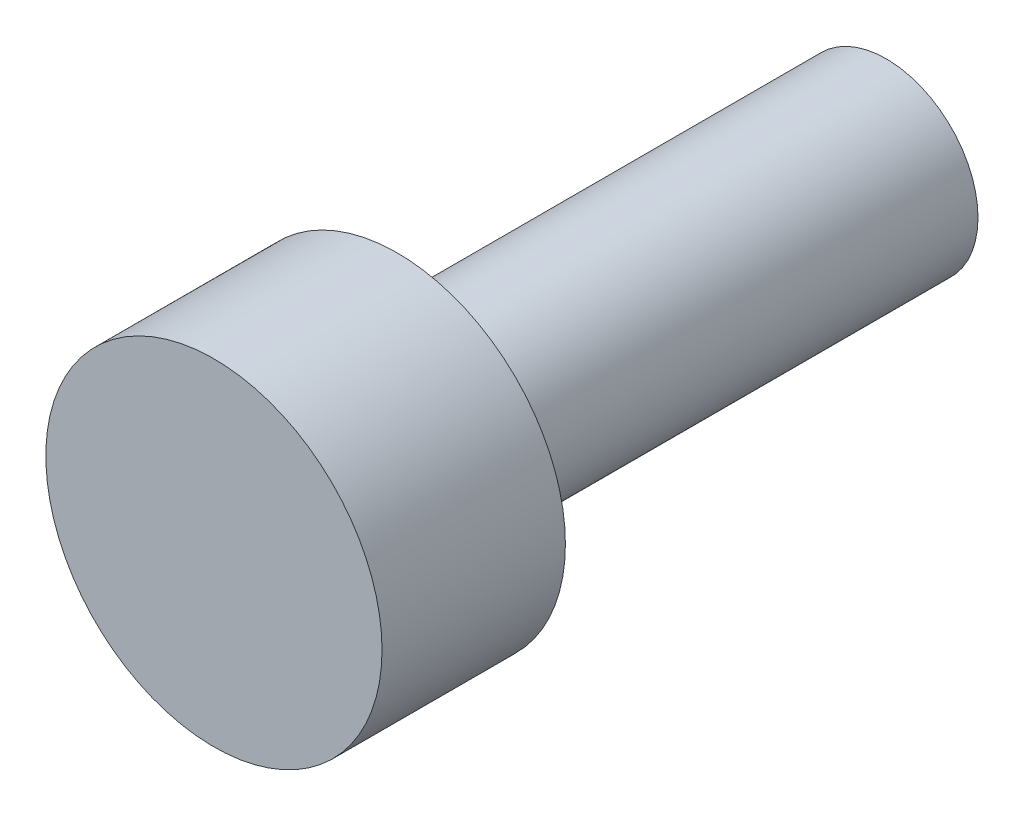
ISO-10303-21;
HEADER;
FILE_DESCRIPTION(('STEP AP214'),'2;1');
FILE_NAME('part.step','',(''),(''),'','','');
FILE_SCHEMA(('AUTOMOTIVE_DESIGN { 1 0 10303 214 1 1 1 1 }'));
ENDSEC;
DATA;
#1=APPLICATION_CONTEXT('core data for automotive mechanical design processes');
#2=APPLICATION_PROTOCOL_DEFINITION('international standard','automotive_design',2000,#1);
#3=PRODUCT_CONTEXT('',#1,'mechanical');
#4=PRODUCT('Part','Part','',(#3));
#5=PRODUCT_RELATED_PRODUCT_CATEGORY('part','',(#4));
#6=PRODUCT_DEFINITION_FORMATION('','',#4);
#7=PRODUCT_DEFINITION_CONTEXT('part definition',#1,'design');
#8=PRODUCT_DEFINITION('design','',#6,#7);
#9=PRODUCT_DEFINITION_SHAPE('','',#8);
#10=(LENGTH_UNIT() NAMED_UNIT(*) SI_UNIT(.MILLI.,.METRE.));
#11=(NAMED_UNIT(*) PLANE_ANGLE_UNIT() SI_UNIT($,.RADIAN.));
#12=(NAMED_UNIT(*) SI_UNIT($,.STERADIAN.) SOLID_ANGLE_UNIT());
#13=UNCERTAINTY_MEASURE_WITH_UNIT(LENGTH_MEASURE(1.E-05),#10,'distance_accuracy_value','');
#14=(GEOMETRIC_REPRESENTATION_CONTEXT(3) GLOBAL_UNCERTAINTY_ASSIGNED_CONTEXT((#13)) GLOBAL_UNIT_ASSIGNED_CONTEXT((#10,
#11,#12)) REPRESENTATION_CONTEXT('',''));
#15=CARTESIAN_POINT('',(0.,0.,0.));
#16=DIRECTION('',(0.,0.,1.));
#17=DIRECTION('',(1.,0.,0.));
#18=AXIS2_PLACEMENT_3D('',#15,#16,#17);
#19=CARTESIAN_POINT('',(0.,0.,8.));
#20=DIRECTION('',(0.,0.,-1.));
#21=DIRECTION('',(-1.,0.,0.));
#22=AXIS2_PLACEMENT_3D('',#19,#20,#21);
#23=CYLINDRICAL_SURFACE('',#22,1.5);
#24=CARTESIAN_POINT('',(0.,0.,8.));
#25=DIRECTION('',(0.,0.,1.));
#26=DIRECTION('',(1.,0.,0.));
#27=AXIS2_PLACEMENT_3D('',#24,#25,#26);
#28=CIRCLE('',#27,1.5);
#29=CARTESIAN_POINT('',(1.5,0.,8.));
#30=VERTEX_POINT('',#29);
#31=EDGE_CURVE('E10',#30,#30,#28,.T.);
#32=ORIENTED_EDGE('',*,*,#31,.F.);
#33=EDGE_LOOP('',(#32));
#34=FACE_BOUND('',#33,.T.);
#35=CARTESIAN_POINT('',(0.,0.,0.));
#36=DIRECTION('',(0.,0.,1.));
#37=DIRECTION('',(1.,0.,0.));
#38=AXIS2_PLACEMENT_3D('',#35,#36,#37);
#39=CIRCLE('',#38,1.5);
#40=CARTESIAN_POINT('',(1.5,0.,0.));
#41=VERTEX_POINT('',#40);
#42=EDGE_CURVE('E40',#41,#41,#39,.T.);
#43=ORIENTED_EDGE('',*,*,#42,.T.);
#44=EDGE_LOOP('',(#43));
#45=FACE_BOUND('',#44,.T.);
#46=ADVANCED_FACE('F37',(#34,#45),#23,.T.);
#47=CARTESIAN_POINT('',(0.,0.,0.));
#48=DIRECTION('',(0.,0.,1.));
#49=DIRECTION('',(1.,0.,0.));
#50=AXIS2_PLACEMENT_3D('',#47,#48,#49);
#51=PLANE('',#50);
#52=ORIENTED_EDGE('',*,*,#42,.F.);
#53=EDGE_LOOP('',(#52));
#54=FACE_BOUND('',#53,.T.);
#55=ADVANCED_FACE('F60',(#54),#51,.F.);
#56=CARTESIAN_POINT('',(0.,0.,11.));
#57=DIRECTION('',(0.,0.,-1.));
#58=DIRECTION('',(-1.,0.,0.));
#59=AXIS2_PLACEMENT_3D('',#56,#57,#58);
#60=CYLINDRICAL_SURFACE('',#59,2.75);
#61=CARTESIAN_POINT('',(0.,0.,11.));
#62=DIRECTION('',(0.,0.,1.));
#63=DIRECTION('',(1.,0.,0.));
#64=AXIS2_PLACEMENT_3D('',#61,#62,#63);
#65=CIRCLE('',#64,2.75);
#66=CARTESIAN_POINT('',(2.75,0.,11.));
#67=VERTEX_POINT('',#66);
#68=EDGE_CURVE('E47',#67,#67,#65,.T.);
#69=ORIENTED_EDGE('',*,*,#68,.F.);
#70=EDGE_LOOP('',(#69));
#71=FACE_BOUND('',#70,.T.);
#72=CARTESIAN_POINT('',(0.,0.,8.));
#73=DIRECTION('',(0.,0.,1.));
#74=DIRECTION('',(1.,0.,0.));
#75=AXIS2_PLACEMENT_3D('',#72,#73,#74);
#76=CIRCLE('',#75,2.75);
#77=CARTESIAN_POINT('',(2.75,0.,8.));
#78=VERTEX_POINT('',#77);
#79=EDGE_CURVE('E49',#78,#78,#76,.T.);
#80=ORIENTED_EDGE('',*,*,#79,.T.);
#81=EDGE_LOOP('',(#80));
#82=FACE_BOUND('',#81,.T.);
#83=ADVANCED_FACE('F57',(#71,#82),#60,.T.);
#84=CARTESIAN_POINT('',(0.,0.,11.));
#85=DIRECTION('',(0.,0.,1.));
#86=DIRECTION('',(1.,0.,0.));
#87=AXIS2_PLACEMENT_3D('',#84,#85,#86);
#88=PLANE('',#87);
#89=ORIENTED_EDGE('',*,*,#68,.T.);
#90=EDGE_LOOP('',(#89));
#91=FACE_BOUND('',#90,.T.);
#92=ADVANCED_FACE('F55',(#91),#88,.T.);
#93=CARTESIAN_POINT('',(0.,0.,8.));
#94=DIRECTION('',(0.,0.,1.));
#95=DIRECTION('',(1.,0.,0.));
#96=AXIS2_PLACEMENT_3D('',#93,#94,#95);
#97=PLANE('',#96);
#98=ORIENTED_EDGE('',*,*,#31,.T.);
#99=EDGE_LOOP('',(#98));
#100=FACE_BOUND('',#99,.T.);
#101=ORIENTED_EDGE('',*,*,#79,.F.);
#102=EDGE_LOOP('',(#101));
#103=FACE_BOUND('',#102,.T.);
#104=ADVANCED_FACE('F64',(#100,#103),#97,.F.);
#105=CLOSED_SHELL('',(#46,#55,#83,#92,#104));
#106=MANIFOLD_SOLID_BREP('B2',#105);
#107=ADVANCED_BREP_SHAPE_REPRESENTATION('',(#18,#106),#14);
#108=SHAPE_DEFINITION_REPRESENTATION(#9,#107);
ENDSEC;
END-ISO-10303-21;
